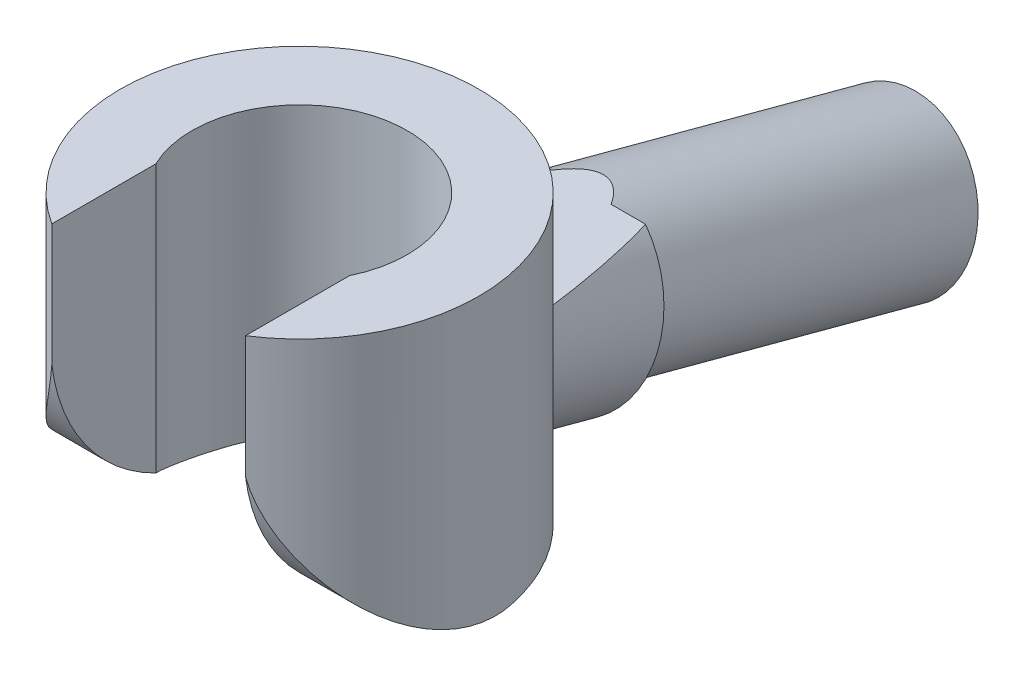
ISO-10303-21;
HEADER;
FILE_DESCRIPTION(('STEP AP214'),'2;1');
FILE_NAME('part.step','',(''),(''),'','','');
FILE_SCHEMA(('AUTOMOTIVE_DESIGN { 1 0 10303 214 1 1 1 1 }'));
ENDSEC;
DATA;
#1=APPLICATION_CONTEXT('core data for automotive mechanical design processes');
#2=APPLICATION_PROTOCOL_DEFINITION('international standard','automotive_design',2000,#1);
#3=PRODUCT_CONTEXT('',#1,'mechanical');
#4=PRODUCT('Part','Part','',(#3));
#5=PRODUCT_RELATED_PRODUCT_CATEGORY('part','',(#4));
#6=PRODUCT_DEFINITION_FORMATION('','',#4);
#7=PRODUCT_DEFINITION_CONTEXT('part definition',#1,'design');
#8=PRODUCT_DEFINITION('design','',#6,#7);
#9=PRODUCT_DEFINITION_SHAPE('','',#8);
#10=(LENGTH_UNIT() NAMED_UNIT(*) SI_UNIT(.MILLI.,.METRE.));
#11=(NAMED_UNIT(*) PLANE_ANGLE_UNIT() SI_UNIT($,.RADIAN.));
#12=(NAMED_UNIT(*) SI_UNIT($,.STERADIAN.) SOLID_ANGLE_UNIT());
#13=UNCERTAINTY_MEASURE_WITH_UNIT(LENGTH_MEASURE(1.E-05),#10,'distance_accuracy_value','');
#14=(GEOMETRIC_REPRESENTATION_CONTEXT(3) GLOBAL_UNCERTAINTY_ASSIGNED_CONTEXT((#13)) GLOBAL_UNIT_ASSIGNED_CONTEXT((#10,
#11,#12)) REPRESENTATION_CONTEXT('',''));
#15=CARTESIAN_POINT('',(0.,0.,0.));
#16=DIRECTION('',(0.,0.,1.));
#17=DIRECTION('',(1.,0.,0.));
#18=AXIS2_PLACEMENT_3D('',#15,#16,#17);
#19=CARTESIAN_POINT('',(0.,2.73055257875065,2.46568982603912));
#20=DIRECTION('',(0.,-0.258819045102525,-0.965925826289067));
#21=DIRECTION('',(0.,0.965925826289067,-0.258819045102525));
#22=AXIS2_PLACEMENT_3D('',#19,#20,#21);
#23=CYLINDRICAL_SURFACE('',#22,1.375);
#24=CARTESIAN_POINT('',(0.,1.08941714587697,-3.65911099154688));
#25=DIRECTION('',(0.,-0.258819045102525,-0.965925826289067));
#26=DIRECTION('',(0.,0.965925826289067,-0.258819045102525));
#27=AXIS2_PLACEMENT_3D('',#24,#25,#26);
#28=CIRCLE('',#27,1.375);
#29=CARTESIAN_POINT('',(0.892201129083852,2.1,-3.92989585119389));
#30=VERTEX_POINT('',#29);
#31=CARTESIAN_POINT('',(-0.892201129083852,2.1,-3.92989585119389));
#32=VERTEX_POINT('',#31);
#33=EDGE_CURVE('E154',#30,#32,#28,.T.);
#34=ORIENTED_EDGE('',*,*,#33,.F.);
#35=CARTESIAN_POINT('',(0.,2.1,0.112435565298172));
#36=DIRECTION('',(0.,1.,0.));
#37=DIRECTION('',(0.,0.,-1.));
#38=AXIS2_PLACEMENT_3D('',#35,#36,#37);
#39=ELLIPSE('',#38,5.31259204458979,1.375);
#40=CARTESIAN_POINT('',(1.24165045050928,2.1,-2.16986270504613));
#41=VERTEX_POINT('',#40);
#42=EDGE_CURVE('E138',#30,#41,#39,.F.);
#43=ORIENTED_EDGE('',*,*,#42,.T.);
#44=CARTESIAN_POINT('',(0.,2.82350474806387,-2.5));
#45=CARTESIAN_POINT('',(0.0756746206926173,2.82350481973341,-2.50000010305877));
#46=CARTESIAN_POINT('',(0.151348466781546,2.81794464872381,-2.49653681192855));
#47=CARTESIAN_POINT('',(0.300469222771982,2.79585754116698,-2.48300742184337));
#48=CARTESIAN_POINT('',(0.373915900409412,2.77932946489794,-2.47294063669243));
#49=CARTESIAN_POINT('',(0.516418098028429,2.73575134684504,-2.44715137212053));
#50=CARTESIAN_POINT('',(0.585480605710097,2.70871856411541,-2.43143817283314));
#51=CARTESIAN_POINT('',(0.717626682065278,2.64466303476343,-2.39576716763654));
#52=CARTESIAN_POINT('',(0.780708395119856,2.60763720128497,-2.37580805056634));
#53=CARTESIAN_POINT('',(0.901086748627024,2.52296993291815,-2.33286143686651));
#54=CARTESIAN_POINT('',(0.958166564467688,2.47505538269466,-2.30980369991073));
#55=CARTESIAN_POINT('',(1.06293822514273,2.36990313720084,-2.26350313879612));
#56=CARTESIAN_POINT('',(1.11062912830766,2.31266450781463,-2.24026029631495));
#57=CARTESIAN_POINT('',(1.19490798443668,2.19014375881825,-2.19646131225086));
#58=CARTESIAN_POINT('',(1.23156403467442,2.12491461966672,-2.1758891574924));
#59=CARTESIAN_POINT('',(1.29281867775416,1.9877231005591,-2.14006865928946));
#60=CARTESIAN_POINT('',(1.31743403935912,1.91577025194761,-2.12481292037677));
#61=CARTESIAN_POINT('',(1.35196875396347,1.77540392350226,-2.10298713986408));
#62=CARTESIAN_POINT('',(1.36316422192769,1.70741747844747,-2.095670752312));
#63=CARTESIAN_POINT('',(1.37545527447044,1.57016071933377,-2.08762498843449));
#64=CARTESIAN_POINT('',(1.37654861049603,1.50089012288367,-2.08689707858648));
#65=CARTESIAN_POINT('',(1.36942214648426,1.36516534456266,-2.09157692756388));
#66=CARTESIAN_POINT('',(1.36147772328356,1.29868858179155,-2.09680326965645));
#67=CARTESIAN_POINT('',(1.33757520770094,1.16780043102245,-2.11212928781745));
#68=CARTESIAN_POINT('',(1.32161438075243,1.10338975579292,-2.12223062680546));
#69=CARTESIAN_POINT('',(1.2791679773478,0.966985833322772,-2.14812597382072));
#70=CARTESIAN_POINT('',(1.25136645781807,0.895531923486745,-2.16459047646282));
#71=CARTESIAN_POINT('',(1.18674362860837,0.757616002295125,-2.20068376500393));
#72=CARTESIAN_POINT('',(1.14990992252638,0.691161017018117,-2.22031688696916));
#73=CARTESIAN_POINT('',(1.05916445052434,0.551013912644696,-2.26522461488661));
#74=CARTESIAN_POINT('',(1.00329491375036,0.478681330528588,-2.29082450757703));
#75=CARTESIAN_POINT('',(0.879492603879842,0.344827550156755,-2.34114172723943));
#76=CARTESIAN_POINT('',(0.811573876225654,0.283293928182841,-2.36586004198145));
#77=CARTESIAN_POINT('',(0.683206479212053,0.18815012776524,-2.40551568757814));
#78=CARTESIAN_POINT('',(0.625338666117882,0.151429857859372,-2.42133254007577));
#79=CARTESIAN_POINT('',(0.503874303996156,0.0872658339551569,-2.44948649690103));
#80=CARTESIAN_POINT('',(0.44028334169336,0.0598131550529236,-2.46182694717713));
#81=CARTESIAN_POINT('',(0.308063504573246,0.0157096646949467,-2.4818535818298));
#82=CARTESIAN_POINT('',(0.239395552336617,-0.000844918187461641,-2.48949826474742));
#83=CARTESIAN_POINT('',(0.0998110285036795,-0.0213367757863876,-2.4989823585276));
#84=CARTESIAN_POINT('',(0.0288963676595743,-0.0252844959717188,-2.50082657537144));
#85=CARTESIAN_POINT('',(-0.102748491236638,-0.0205709167046227,-2.49863664971227));
#86=CARTESIAN_POINT('',(-0.163557904460064,-0.0135440835903115,-2.49536443063183));
#87=CARTESIAN_POINT('',(-0.283003456159065,0.0096760962301037,-2.48465393798624));
#88=CARTESIAN_POINT('',(-0.34163935961826,0.0258704311334318,-2.47721521529993));
#89=CARTESIAN_POINT('',(-0.455701918169974,0.0665604500597686,-2.45880008644263));
#90=CARTESIAN_POINT('',(-0.511108649341796,0.0911023516525677,-2.44780400132952));
#91=CARTESIAN_POINT('',(-0.61753266617702,0.14729140231227,-2.42314752670379));
#92=CARTESIAN_POINT('',(-0.66854726392904,0.17894286014885,-2.40948552216394));
#93=CARTESIAN_POINT('',(-0.787425321158469,0.263714129024352,-2.3738871353891));
#94=CARTESIAN_POINT('',(-0.852665282212235,0.320115091501058,-2.35097667184598));
#95=CARTESIAN_POINT('',(-0.972585013733016,0.442852863124011,-2.3039627928177));
#96=CARTESIAN_POINT('',(-1.02724319459977,0.509209505196378,-2.27985706188609));
#97=CARTESIAN_POINT('',(-1.12629840209362,0.650905567293822,-2.23259891902422));
#98=CARTESIAN_POINT('',(-1.17054866646216,0.726353102402769,-2.20946353479141));
#99=CARTESIAN_POINT('',(-1.24716117896756,0.884046710061889,-2.16714235299558));
#100=CARTESIAN_POINT('',(-1.27953632613048,0.966285286309594,-2.14795227996602));
#101=CARTESIAN_POINT('',(-1.32685767340735,1.12204388884194,-2.1189827475853));
#102=CARTESIAN_POINT('',(-1.34379952310308,1.19476001058908,-2.10817239974021));
#103=CARTESIAN_POINT('',(-1.36736312572277,1.34250713030354,-2.09296995367779));
#104=CARTESIAN_POINT('',(-1.37399620091774,1.41753549616735,-2.08857081427194));
#105=CARTESIAN_POINT('',(-1.37579815356936,1.56844629871396,-2.08738789306386));
#106=CARTESIAN_POINT('',(-1.37087755029707,1.64433084175383,-2.09066355047372));
#107=CARTESIAN_POINT('',(-1.34869588547905,1.79351727418247,-2.10503905226756));
#108=CARTESIAN_POINT('',(-1.33143912004852,1.8668200533579,-2.1161361727785));
#109=CARTESIAN_POINT('',(-1.28769755080016,1.99954219122673,-2.14298791118527));
#110=CARTESIAN_POINT('',(-1.26258014986354,2.05956874755226,-2.15801751022668));
#111=CARTESIAN_POINT('',(-1.20369987647326,2.1742053935455,-2.19140346615113));
#112=CARTESIAN_POINT('',(-1.16993423053794,2.22881373779009,-2.2097608897105));
#113=CARTESIAN_POINT('',(-1.09282879509049,2.3341828657609,-2.24892804530785));
#114=CARTESIAN_POINT('',(-1.04911011587821,2.384637251991,-2.26981287658826));
#115=CARTESIAN_POINT('',(-0.95416866149967,2.47803288973589,-2.31133044591885));
#116=CARTESIAN_POINT('',(-0.902942911880863,2.52097114834234,-2.33196308051665));
#117=CARTESIAN_POINT('',(-0.788390350564423,2.60289454261766,-2.37329211518011));
#118=CARTESIAN_POINT('',(-0.724359567096987,2.64100836466509,-2.39377337204453));
#119=CARTESIAN_POINT('',(-0.590021914776225,2.7068766692259,-2.43037435788196));
#120=CARTESIAN_POINT('',(-0.51971505507127,2.73463116683933,-2.44649409321244));
#121=CARTESIAN_POINT('',(-0.37558472375676,2.77892663737088,-2.47269682255301));
#122=CARTESIAN_POINT('',(-0.301817629726865,2.79560629147746,-2.48285428267203));
#123=CARTESIAN_POINT('',(-0.152033088172532,2.81789405947923,-2.49650506643015));
#124=CARTESIAN_POINT('',(-0.0760161532806134,2.82350467607086,-2.49999989647611));
#125=CARTESIAN_POINT('',(0.,2.82350474806387,-2.5));
#126=B_SPLINE_CURVE_WITH_KNOTS('',3,(#44,#45,#46,#47,#48,#49,#50,#51,#52,#53,#54,#55,#56,#57,
#58,#59,#60,#61,#62,#63,#64,#65,#66,#67,#68,#69,#70,#71,#72,#73,#74,#75,#76,#77,#78,#79,#80,#81,
#82,#83,#84,#85,#86,#87,#88,#89,#90,#91,#92,#93,#94,#95,#96,#97,#98,#99,#100,#101,#102,#103,
#104,#105,#106,#107,#108,#109,#110,#111,#112,#113,#114,#115,#116,#117,#118,#119,#120,#121,#122,
#123,#124,#125),.UNSPECIFIED.,.T.,.F.,(4,2,2,2,2,2,2,2,2,2,2,2,2,2,2,2,2,2,2,2,2,2,2,2,2,2,2,2,
2,2,2,2,2,2,2,2,2,2,2,2,4),(0.,0.226745055751776,0.453513677239695,0.679911286365917,
0.906378909975966,1.13931803915239,1.37228051927934,1.60377441431508,1.83494498919001,
2.04173531040099,2.24857165831114,2.44927075661658,2.65003836421814,2.88446746190319,
3.11922012513576,3.40268327110739,3.68581813663379,3.89603589261602,4.10605062265587,
4.31789572851208,4.52956526361767,4.71258246081535,4.89561938983725,5.07968668791708,
5.26386584301999,5.53012762028791,5.79692704487656,6.06728902783554,6.33735646155111,
6.56281120355592,6.78801815003489,7.01497502174533,7.24185289334635,7.44130979437842,
7.64083074126372,7.84983838813175,8.05892907306925,8.28969644575822,8.52046348207278,
8.74828339300891,8.97605178822374),.UNSPECIFIED.);
#127=CARTESIAN_POINT('',(0.233011540176371,0.,-2.48911743839953));
#128=VERTEX_POINT('',#127);
#129=EDGE_CURVE('E147',#41,#128,#126,.T.);
#130=ORIENTED_EDGE('',*,*,#129,.T.);
#131=CARTESIAN_POINT('',(-0.23301154017637,0.,-2.48911743839953));
#132=VERTEX_POINT('',#131);
#133=EDGE_CURVE('E75',#128,#132,#126,.T.);
#134=ORIENTED_EDGE('',*,*,#133,.T.);
#135=CARTESIAN_POINT('',(-1.24165045050928,2.1,-2.16986270504613));
#136=VERTEX_POINT('',#135);
#137=EDGE_CURVE('E144',#132,#136,#126,.T.);
#138=ORIENTED_EDGE('',*,*,#137,.T.);
#139=EDGE_CURVE('E128',#136,#32,#39,.F.);
#140=ORIENTED_EDGE('',*,*,#139,.T.);
#141=EDGE_LOOP('',(#34,#43,#130,#134,#138,#140));
#142=FACE_BOUND('',#141,.T.);
#143=ADVANCED_FACE('F51',(#142),#23,.T.);
#144=CARTESIAN_POINT('',(0.,1.08941714587697,-3.65911099154688));
#145=DIRECTION('',(0.,-0.258819045102525,-0.965925826289067));
#146=DIRECTION('',(0.,0.965925826289067,-0.258819045102525));
#147=AXIS2_PLACEMENT_3D('',#144,#145,#146);
#148=PLANE('',#147);
#149=ORIENTED_EDGE('',*,*,#33,.T.);
#150=DIRECTION('',(1.,0.,0.));
#151=VECTOR('',#150,1.);
#152=CARTESIAN_POINT('',(0.,2.1,-3.92989585119389));
#153=LINE('',#152,#151);
#154=CARTESIAN_POINT('',(-0.413549095922722,2.1,-3.92989585119389));
#155=VERTEX_POINT('',#154);
#156=EDGE_CURVE('E134',#32,#155,#153,.T.);
#157=ORIENTED_EDGE('',*,*,#156,.T.);
#158=CARTESIAN_POINT('',(0.,1.08941714587697,-3.65911099154688));
#159=DIRECTION('',(0.,-0.258819045102525,-0.965925826289067));
#160=DIRECTION('',(0.,0.965925826289067,-0.258819045102525));
#161=AXIS2_PLACEMENT_3D('',#158,#159,#160);
#162=CIRCLE('',#161,1.125);
#163=CARTESIAN_POINT('',(0.413549095922722,2.1,-3.92989585119389));
#164=VERTEX_POINT('',#163);
#165=EDGE_CURVE('E61',#155,#164,#162,.F.);
#166=ORIENTED_EDGE('',*,*,#165,.T.);
#167=EDGE_CURVE('E68',#164,#30,#153,.T.);
#168=ORIENTED_EDGE('',*,*,#167,.T.);
#169=EDGE_LOOP('',(#149,#157,#166,#168));
#170=FACE_BOUND('',#169,.T.);
#171=ADVANCED_FACE('F180',(#170),#148,.T.);
#172=CARTESIAN_POINT('',(0.,2.72572524848298,2.44767398421526));
#173=DIRECTION('',(0.,-0.258819045102525,-0.965925826289067));
#174=DIRECTION('',(0.,0.965925826289067,-0.258819045102525));
#175=AXIS2_PLACEMENT_3D('',#172,#173,#174);
#176=CYLINDRICAL_SURFACE('',#175,1.125);
#177=CARTESIAN_POINT('',(0.,-0.152914270615149,-8.2955549577344));
#178=DIRECTION('',(0.,-0.258819045102525,-0.965925826289067));
#179=DIRECTION('',(0.,0.965925826289067,-0.258819045102525));
#180=AXIS2_PLACEMENT_3D('',#177,#178,#179);
#181=CIRCLE('',#180,1.125);
#182=CARTESIAN_POINT('',(0.,0.933752283960052,-8.58672638347474));
#183=VERTEX_POINT('',#182);
#184=EDGE_CURVE('E369',#183,#183,#181,.T.);
#185=ORIENTED_EDGE('',*,*,#184,.F.);
#186=EDGE_LOOP('',(#185));
#187=FACE_BOUND('',#186,.T.);
#188=ORIENTED_EDGE('',*,*,#165,.F.);
#189=CARTESIAN_POINT('',(0.,2.1,0.112435565298172));
#190=DIRECTION('',(0.,1.,0.));
#191=DIRECTION('',(0.,0.,-1.));
#192=AXIS2_PLACEMENT_3D('',#189,#190,#191);
#193=ELLIPSE('',#192,4.34666621830074,1.125);
#194=EDGE_CURVE('E13',#155,#164,#193,.F.);
#195=ORIENTED_EDGE('',*,*,#194,.T.);
#196=EDGE_LOOP('',(#188,#195));
#197=FACE_BOUND('',#196,.T.);
#198=ADVANCED_FACE('F176',(#187,#197),#176,.T.);
#199=CARTESIAN_POINT('',(0.,4.,0.));
#200=DIRECTION('',(0.,1.,0.));
#201=DIRECTION('',(0.,0.,1.));
#202=AXIS2_PLACEMENT_3D('',#199,#200,#201);
#203=PLANE('',#202);
#204=DIRECTION('',(0.,0.,1.));
#205=VECTOR('',#204,1.);
#206=CARTESIAN_POINT('',(-1.35,4.,3.15418491724055));
#207=LINE('',#206,#205);
#208=CARTESIAN_POINT('',(-1.35,4.,0.653834841531102));
#209=VERTEX_POINT('',#208);
#210=CARTESIAN_POINT('',(-1.35,4.,2.10416254125008));
#211=VERTEX_POINT('',#210);
#212=EDGE_CURVE('E388',#209,#211,#207,.T.);
#213=ORIENTED_EDGE('',*,*,#212,.F.);
#214=CARTESIAN_POINT('',(0.,4.,0.));
#215=DIRECTION('',(0.,1.,0.));
#216=DIRECTION('',(0.,0.,1.));
#217=AXIS2_PLACEMENT_3D('',#214,#215,#216);
#218=CIRCLE('',#217,1.5);
#219=CARTESIAN_POINT('',(1.35,4.,0.6538348415311));
#220=VERTEX_POINT('',#219);
#221=EDGE_CURVE('E402',#220,#209,#218,.T.);
#222=ORIENTED_EDGE('',*,*,#221,.F.);
#223=DIRECTION('',(0.,0.,-1.));
#224=VECTOR('',#223,1.);
#225=CARTESIAN_POINT('',(1.35,4.,0.));
#226=LINE('',#225,#224);
#227=CARTESIAN_POINT('',(1.35,4.,2.10416254125008));
#228=VERTEX_POINT('',#227);
#229=EDGE_CURVE('E340',#228,#220,#226,.T.);
#230=ORIENTED_EDGE('',*,*,#229,.F.);
#231=CARTESIAN_POINT('',(0.,4.,0.));
#232=DIRECTION('',(0.,1.,0.));
#233=DIRECTION('',(0.,0.,1.));
#234=AXIS2_PLACEMENT_3D('',#231,#232,#233);
#235=CIRCLE('',#234,2.5);
#236=EDGE_CURVE('E346',#228,#211,#235,.T.);
#237=ORIENTED_EDGE('',*,*,#236,.T.);
#238=EDGE_LOOP('',(#213,#222,#230,#237));
#239=FACE_BOUND('',#238,.T.);
#240=ADVANCED_FACE('F179',(#239),#203,.T.);
#241=CARTESIAN_POINT('',(0.,0.,0.));
#242=DIRECTION('',(0.,1.,0.));
#243=DIRECTION('',(0.,0.,1.));
#244=AXIS2_PLACEMENT_3D('',#241,#242,#243);
#245=PLANE('',#244);
#246=CARTESIAN_POINT('',(0.,0.,0.));
#247=DIRECTION('',(0.,1.,0.));
#248=DIRECTION('',(0.,0.,1.));
#249=AXIS2_PLACEMENT_3D('',#246,#247,#248);
#250=CIRCLE('',#249,2.5);
#251=CARTESIAN_POINT('',(2.44948974278318,0.,-0.5));
#252=VERTEX_POINT('',#251);
#253=EDGE_CURVE('E352',#252,#128,#250,.T.);
#254=ORIENTED_EDGE('',*,*,#253,.F.);
#255=DIRECTION('',(1.,0.,0.));
#256=VECTOR('',#255,1.);
#257=CARTESIAN_POINT('',(-2.5,0.,-0.5));
#258=LINE('',#257,#256);
#259=CARTESIAN_POINT('',(1.4142135623731,0.,-0.5));
#260=VERTEX_POINT('',#259);
#261=EDGE_CURVE('E372',#260,#252,#258,.T.);
#262=ORIENTED_EDGE('',*,*,#261,.F.);
#263=CARTESIAN_POINT('',(0.,0.,0.));
#264=DIRECTION('',(0.,1.,0.));
#265=DIRECTION('',(0.,0.,1.));
#266=AXIS2_PLACEMENT_3D('',#263,#264,#265);
#267=CIRCLE('',#266,1.5);
#268=CARTESIAN_POINT('',(-1.4142135623731,0.,-0.5));
#269=VERTEX_POINT('',#268);
#270=EDGE_CURVE('E398',#260,#269,#267,.T.);
#271=ORIENTED_EDGE('',*,*,#270,.T.);
#272=CARTESIAN_POINT('',(-2.44948974278318,0.,-0.5));
#273=VERTEX_POINT('',#272);
#274=EDGE_CURVE('E375',#273,#269,#258,.T.);
#275=ORIENTED_EDGE('',*,*,#274,.F.);
#276=EDGE_CURVE('E405',#132,#273,#250,.T.);
#277=ORIENTED_EDGE('',*,*,#276,.F.);
#278=CARTESIAN_POINT('',(0.,0.,0.));
#279=DIRECTION('',(0.,1.,0.));
#280=DIRECTION('',(0.,0.,1.));
#281=AXIS2_PLACEMENT_3D('',#278,#279,#280);
#282=CIRCLE('',#281,2.5);
#283=EDGE_CURVE('E162',#132,#128,#282,.F.);
#284=ORIENTED_EDGE('',*,*,#283,.T.);
#285=EDGE_LOOP('',(#254,#262,#271,#275,#277,#284));
#286=FACE_BOUND('',#285,.T.);
#287=ADVANCED_FACE('F230',(#286),#245,.F.);
#288=CARTESIAN_POINT('',(0.,4.,0.));
#289=DIRECTION('',(0.,-1.,0.));
#290=DIRECTION('',(0.,0.,-1.));
#291=AXIS2_PLACEMENT_3D('',#288,#289,#290);
#292=CYLINDRICAL_SURFACE('',#291,2.5);
#293=DIRECTION('',(0.,-1.,0.));
#294=VECTOR('',#293,1.);
#295=CARTESIAN_POINT('',(-1.35,4.,2.10416254125008));
#296=LINE('',#295,#294);
#297=CARTESIAN_POINT('',(-1.35,2.3,2.10416254125008));
#298=VERTEX_POINT('',#297);
#299=EDGE_CURVE('E395',#298,#211,#296,.F.);
#300=ORIENTED_EDGE('',*,*,#299,.T.);
#301=ORIENTED_EDGE('',*,*,#236,.F.);
#302=DIRECTION('',(0.,-1.,0.));
#303=VECTOR('',#302,1.);
#304=CARTESIAN_POINT('',(1.35,4.,2.10416254125008));
#305=LINE('',#304,#303);
#306=CARTESIAN_POINT('',(1.35,2.3,2.10416254125008));
#307=VERTEX_POINT('',#306);
#308=EDGE_CURVE('E392',#228,#307,#305,.T.);
#309=ORIENTED_EDGE('',*,*,#308,.T.);
#310=CARTESIAN_POINT('',(1.35,2.3,2.10416254125008));
#311=CARTESIAN_POINT('',(1.36351517193992,2.23038087333844,2.09549047514903));
#312=CARTESIAN_POINT('',(1.38091321280894,2.16205714878144,2.0841517596051));
#313=CARTESIAN_POINT('',(1.42154094714728,2.02847055895948,2.05665139196168));
#314=CARTESIAN_POINT('',(1.44474532500651,1.96319582930358,2.04051062053209));
#315=CARTESIAN_POINT('',(1.49507030762803,1.83590336040458,2.0039280390569));
#316=CARTESIAN_POINT('',(1.52217030098942,1.77387068641268,1.98350862187017));
#317=CARTESIAN_POINT('',(1.57900985866205,1.65247301925095,1.93856756619751));
#318=CARTESIAN_POINT('',(1.60875289949933,1.59311169909167,1.91404048606603));
#319=CARTESIAN_POINT('',(1.67850902947904,1.46031402648567,1.85345744661983));
#320=CARTESIAN_POINT('',(1.7190206503008,1.38772493084354,1.81611262083681));
#321=CARTESIAN_POINT('',(1.80076748103185,1.24667889391936,1.7350972453077));
#322=CARTESIAN_POINT('',(1.84200262271298,1.1782215656852,1.69142728923498));
#323=CARTESIAN_POINT('',(1.96493734768176,0.978606213693664,1.55064796955403));
#324=CARTESIAN_POINT('',(2.04574746312107,0.853414621066346,1.44386508775217));
#325=CARTESIAN_POINT('',(2.17625604363792,0.651399105226241,1.23492774735109));
#326=CARTESIAN_POINT('',(2.22864347954362,0.570366414153451,1.13848608966499));
#327=CARTESIAN_POINT('',(2.32271203983696,0.421191120436153,0.931577509880182));
#328=CARTESIAN_POINT('',(2.36442096881449,0.353015166182571,0.821148154330056));
#329=CARTESIAN_POINT('',(2.42678036055965,0.243331863034661,0.608839513243117));
#330=CARTESIAN_POINT('',(2.44987427801288,0.199231581227174,0.509021496327746));
#331=CARTESIAN_POINT('',(2.48378642408959,0.123395394578649,0.302761855224059));
#332=CARTESIAN_POINT('',(2.49461892111016,0.0916451465338719,0.196328082207745));
#333=CARTESIAN_POINT('',(2.50015358805605,0.0556468159376632,0.0398593903577073));
#334=CARTESIAN_POINT('',(2.50046361005327,0.0459003852551461,-0.00880894379472793));
#335=CARTESIAN_POINT('',(2.49820510086762,0.0291871888138619,-0.106564880691923));
#336=CARTESIAN_POINT('',(2.49563679697656,0.0222202036304546,-0.155652450027333));
#337=CARTESIAN_POINT('',(2.48754309497462,0.0110718598248004,-0.254125787871645));
#338=CARTESIAN_POINT('',(2.48200423535001,0.00690337821722598,-0.303511893898604));
#339=CARTESIAN_POINT('',(2.46796617473349,0.00136294538310998,-0.402032537699327));
#340=CARTESIAN_POINT('',(2.45946622061083,-8.2937782742311E-06,-0.45116700824249));
#341=CARTESIAN_POINT('',(2.44948974278318,0.,-0.5));
#342=B_SPLINE_CURVE_WITH_KNOTS('',3,(#310,#311,#312,#313,#314,#315,#316,#317,#318,#319,#320,
#321,#322,#323,#324,#325,#326,#327,#328,#329,#330,#331,#332,#333,#334,#335,#336,#337,#338,#339,
#340,#341),.UNSPECIFIED.,.F.,.F.,(4,2,2,2,2,2,2,2,2,2,2,2,2,2,2,4),(0.,0.21388345861973,
0.426850157356095,0.638728926151715,0.850890635397252,1.12391365881172,1.3969110730166,
1.94367564672557,2.35157065835715,2.75839254050403,3.09169557464955,3.42461034994189,
3.57338663818592,3.72215117889017,3.87159563601557,4.02107813093012),.UNSPECIFIED.);
#343=EDGE_CURVE('E215',#307,#252,#342,.T.);
#344=ORIENTED_EDGE('',*,*,#343,.T.);
#345=ORIENTED_EDGE('',*,*,#253,.T.);
#346=ORIENTED_EDGE('',*,*,#129,.F.);
#347=CARTESIAN_POINT('',(0.,2.1,0.));
#348=DIRECTION('',(0.,1.,0.));
#349=DIRECTION('',(0.,0.,1.));
#350=AXIS2_PLACEMENT_3D('',#347,#348,#349);
#351=CIRCLE('',#350,2.5);
#352=EDGE_CURVE('E131',#136,#41,#351,.F.);
#353=ORIENTED_EDGE('',*,*,#352,.F.);
#354=ORIENTED_EDGE('',*,*,#137,.F.);
#355=ORIENTED_EDGE('',*,*,#276,.T.);
#356=CARTESIAN_POINT('',(-2.44948974278318,0.,-0.5));
#357=CARTESIAN_POINT('',(-2.46043782423083,-1.22960023710364E-05,-0.446426952332522));
#358=CARTESIAN_POINT('',(-2.46960447026707,0.00164025307823841,-0.39249021938658));
#359=CARTESIAN_POINT('',(-2.48437182629474,0.00831758881083121,-0.284354565669709));
#360=CARTESIAN_POINT('',(-2.48997359741295,0.0133413710601557,-0.230155727762011));
#361=CARTESIAN_POINT('',(-2.49759057772106,0.0267612330084932,-0.122269699552724));
#362=CARTESIAN_POINT('',(-2.49962817163385,0.0351358563903735,-0.0685814375944163));
#363=CARTESIAN_POINT('',(-2.50027938514236,0.0552011617026611,0.0381770969913491));
#364=CARTESIAN_POINT('',(-2.49889298114054,0.0668918664863675,0.0912473653571819));
#365=CARTESIAN_POINT('',(-2.48979976556173,0.106789172049219,0.248852177360237));
#366=CARTESIAN_POINT('',(-2.47716986967941,0.139841959774321,0.351948314177035));
#367=CARTESIAN_POINT('',(-2.44052777781505,0.217481665588309,0.551517212278167));
#368=CARTESIAN_POINT('',(-2.41650276032852,0.262081550445002,0.647982372219373));
#369=CARTESIAN_POINT('',(-2.35060879419707,0.376063515918866,0.860488375430432));
#370=CARTESIAN_POINT('',(-2.30554723309455,0.448865279724963,0.973701151540438));
#371=CARTESIAN_POINT('',(-2.20445441955575,0.608021996260256,1.18497562153919));
#372=CARTESIAN_POINT('',(-2.14838931150038,0.69441861060799,1.28298883986982));
#373=CARTESIAN_POINT('',(-2.05122492939242,0.84507957845647,1.43081832843496));
#374=CARTESIAN_POINT('',(-2.01200913793902,0.906106428108687,1.48527845345911));
#375=CARTESIAN_POINT('',(-1.9320699834494,1.0323474006754,1.58786975107115));
#376=CARTESIAN_POINT('',(-1.89134678494387,1.09756106717395,1.63600161178217));
#377=CARTESIAN_POINT('',(-1.80974670127137,1.23179327068719,1.72582929496856));
#378=CARTESIAN_POINT('',(-1.76887073442344,1.3007988675339,1.76754536030468));
#379=CARTESIAN_POINT('',(-1.68824199701682,1.44287714149765,1.84470761714713));
#380=CARTESIAN_POINT('',(-1.64848918222079,1.51594965809418,1.88015405588396));
#381=CARTESIAN_POINT('',(-1.58267176897159,1.64536631295981,1.93557541304816));
#382=CARTESIAN_POINT('',(-1.55588638392226,1.70067880502947,1.9571057555279));
#383=CARTESIAN_POINT('',(-1.50481813669568,1.81360054534255,1.99663776907348));
#384=CARTESIAN_POINT('',(-1.48053233154361,1.87120697922695,2.01464361290913));
#385=CARTESIAN_POINT('',(-1.43544923218275,1.98921303848159,2.0470126446107));
#386=CARTESIAN_POINT('',(-1.41467261911497,2.04962671771248,2.06135447657868));
#387=CARTESIAN_POINT('',(-1.37815168225906,2.17299579035615,2.08594976149757));
#388=CARTESIAN_POINT('',(-1.36242648035574,2.23595984897034,2.09618771480464));
#389=CARTESIAN_POINT('',(-1.35000000000006,2.30000000000002,2.1041625412501));
#390=B_SPLINE_CURVE_WITH_KNOTS('',3,(#356,#357,#358,#359,#360,#361,#362,#363,#364,#365,#366,
#367,#368,#369,#370,#371,#372,#373,#374,#375,#376,#377,#378,#379,#380,#381,#382,#383,#384,#385,
#386,#387,#388,#389),.UNSPECIFIED.,.F.,.F.,(4,2,2,2,2,2,2,2,2,2,2,2,2,2,2,2,4),(0.,
0.163984580706249,0.327920326621867,0.490822731017619,0.65372625810831,0.979032508084697,
1.30470565595084,1.72824131127714,2.15310112530948,2.42492539179971,2.69672007615975,
2.967638788869,3.23854681604415,3.43374970229534,3.62872006471698,3.82480215083707,
4.0216179811305),.UNSPECIFIED.);
#391=EDGE_CURVE('E202',#273,#298,#390,.T.);
#392=ORIENTED_EDGE('',*,*,#391,.T.);
#393=EDGE_LOOP('',(#300,#301,#309,#344,#345,#346,#353,#354,#355,#392));
#394=FACE_BOUND('',#393,.T.);
#395=ADVANCED_FACE('F53',(#394),#292,.T.);
#396=CARTESIAN_POINT('',(0.,4.,0.));
#397=DIRECTION('',(0.,-1.,0.));
#398=DIRECTION('',(0.,0.,-1.));
#399=AXIS2_PLACEMENT_3D('',#396,#397,#398);
#400=CYLINDRICAL_SURFACE('',#399,1.5);
#401=CARTESIAN_POINT('',(1.35,0.267267543843128,0.653834841531102));
#402=CARTESIAN_POINT('',(1.36633063818247,0.25075720524737,0.620109241700244));
#403=CARTESIAN_POINT('',(1.38149466230228,0.234754125827008,0.585582211188813));
#404=CARTESIAN_POINT('',(1.40933404813439,0.203926628551633,0.514997234861595));
#405=CARTESIAN_POINT('',(1.42200747079128,0.189103134362418,0.478938122598445));
#406=CARTESIAN_POINT('',(1.45609450406794,0.146596706883479,0.368418851244988));
#407=CARTESIAN_POINT('',(1.47346938973809,0.120984548426078,0.291831351532618));
#408=CARTESIAN_POINT('',(1.49607766555339,0.0765508503164539,0.134537602576767));
#409=CARTESIAN_POINT('',(1.50124875907223,0.0577645649591205,0.0538123605953848));
#410=CARTESIAN_POINT('',(1.4982504526512,0.0280436265144617,-0.108627623623909));
#411=CARTESIAN_POINT('',(1.4901284496456,0.0170812769280051,-0.190337823651603));
#412=CARTESIAN_POINT('',(1.46818312898731,0.0066053718119944,-0.309847138386396));
#413=CARTESIAN_POINT('',(1.45951123997034,0.00410269961131612,-0.348412967967329));
#414=CARTESIAN_POINT('',(1.43912788632961,0.000798341478153169,-0.424821288282386));
#415=CARTESIAN_POINT('',(1.42741543235405,-2.79001939336072E-06,-0.462663539264412));
#416=CARTESIAN_POINT('',(1.41421356237334,-1.12953978262727E-13,-0.500000000000036));
#417=B_SPLINE_CURVE_WITH_KNOTS('',3,(#401,#402,#403,#404,#405,#406,#407,#408,#409,#410,#411,
#412,#413,#414,#415,#416),.UNSPECIFIED.,.F.,.F.,(4,2,2,2,2,2,2,4),(0.,0.12278914141707,
0.245673504741852,0.492219080248995,0.740020498675876,0.986940297001302,1.10562669409591,
1.2243517583797),.UNSPECIFIED.);
#418=CARTESIAN_POINT('',(1.35,0.267267543843127,0.6538348415311));
#419=VERTEX_POINT('',#418);
#420=EDGE_CURVE('E209',#419,#260,#417,.T.);
#421=ORIENTED_EDGE('',*,*,#420,.F.);
#422=DIRECTION('',(0.,-1.,0.));
#423=VECTOR('',#422,1.);
#424=CARTESIAN_POINT('',(1.35,4.,0.6538348415311));
#425=LINE('',#424,#423);
#426=EDGE_CURVE('E337',#220,#419,#425,.T.);
#427=ORIENTED_EDGE('',*,*,#426,.F.);
#428=ORIENTED_EDGE('',*,*,#221,.T.);
#429=DIRECTION('',(0.,-1.,0.));
#430=VECTOR('',#429,1.);
#431=CARTESIAN_POINT('',(-1.35,4.,0.653834841531102));
#432=LINE('',#431,#430);
#433=CARTESIAN_POINT('',(-1.35,0.267267543843128,0.653834841531102));
#434=VERTEX_POINT('',#433);
#435=EDGE_CURVE('E345',#434,#209,#432,.F.);
#436=ORIENTED_EDGE('',*,*,#435,.F.);
#437=CARTESIAN_POINT('',(-1.4142135623731,0.,-0.5));
#438=CARTESIAN_POINT('',(-1.42681644830846,-2.81605277952208E-06,-0.464358866911676));
#439=CARTESIAN_POINT('',(-1.43806226018128,0.000727147987933746,-0.428254511041751));
#440=CARTESIAN_POINT('',(-1.45778686385782,0.00373512279118509,-0.355363923365228));
#441=CARTESIAN_POINT('',(-1.46626583386106,0.00601303382846329,-0.318577735633604));
#442=CARTESIAN_POINT('',(-1.48738718228693,0.015253954549242,-0.208017807046626));
#443=CARTESIAN_POINT('',(-1.49587226112636,0.0246221850623208,-0.133592115718953));
#444=CARTESIAN_POINT('',(-1.50176594132719,0.0498436224482136,0.0145743687023676));
#445=CARTESIAN_POINT('',(-1.49916819414523,0.0657005415151696,0.0883147449871424));
#446=CARTESIAN_POINT('',(-1.48355184256055,0.103397060669182,0.233214704131816));
#447=CARTESIAN_POINT('',(-1.4705183403082,0.125245184325978,0.304370445307277));
#448=CARTESIAN_POINT('',(-1.44013942945274,0.166966334837842,0.422597583516235));
#449=CARTESIAN_POINT('',(-1.42510096127744,0.185610308187972,0.470726027291906));
#450=CARTESIAN_POINT('',(-1.39069373302047,0.224974916339269,0.564310339633537));
#451=CARTESIAN_POINT('',(-1.37134015760996,0.245688131836643,0.609774890649423));
#452=CARTESIAN_POINT('',(-1.35000000000052,0.267267543843135,0.653834841531232));
#453=B_SPLINE_CURVE_WITH_KNOTS('',3,(#437,#438,#439,#440,#441,#442,#443,#444,#445,#446,#447,
#448,#449,#450,#451,#452),.UNSPECIFIED.,.F.,.F.,(4,2,2,2,2,2,2,4),(0.,0.113344301097838,
0.226681300770992,0.451941693385612,0.677331138582873,0.903042919601758,1.06405455727978,
1.2245083021788),.UNSPECIFIED.);
#454=EDGE_CURVE('E192',#269,#434,#453,.T.);
#455=ORIENTED_EDGE('',*,*,#454,.F.);
#456=ORIENTED_EDGE('',*,*,#270,.F.);
#457=EDGE_LOOP('',(#421,#427,#428,#436,#455,#456));
#458=FACE_BOUND('',#457,.T.);
#459=ADVANCED_FACE('F222',(#458),#400,.F.);
#460=CARTESIAN_POINT('',(1.35,0.,0.));
#461=DIRECTION('',(1.,0.,0.));
#462=DIRECTION('',(0.,0.,-1.));
#463=AXIS2_PLACEMENT_3D('',#460,#461,#462);
#464=PLANE('',#463);
#465=ORIENTED_EDGE('',*,*,#426,.T.);
#466=CARTESIAN_POINT('',(1.35,2.62427446548915,-0.5));
#467=DIRECTION('',(1.,0.,0.));
#468=DIRECTION('',(0.,0.,-1.));
#469=AXIS2_PLACEMENT_3D('',#466,#467,#468);
#470=CIRCLE('',#469,2.62427446548915);
#471=EDGE_CURVE('E216',#419,#307,#470,.F.);
#472=ORIENTED_EDGE('',*,*,#471,.T.);
#473=ORIENTED_EDGE('',*,*,#308,.F.);
#474=ORIENTED_EDGE('',*,*,#229,.T.);
#475=EDGE_LOOP('',(#465,#472,#473,#474));
#476=FACE_BOUND('',#475,.T.);
#477=ADVANCED_FACE('F187',(#476),#464,.F.);
#478=CARTESIAN_POINT('',(-1.35,0.,3.15418491724055));
#479=DIRECTION('',(-1.,0.,0.));
#480=DIRECTION('',(0.,0.,1.));
#481=AXIS2_PLACEMENT_3D('',#478,#479,#480);
#482=PLANE('',#481);
#483=ORIENTED_EDGE('',*,*,#299,.F.);
#484=CARTESIAN_POINT('',(-1.35,2.62427446548915,-0.5));
#485=DIRECTION('',(-1.,0.,0.));
#486=DIRECTION('',(0.,0.,1.));
#487=AXIS2_PLACEMENT_3D('',#484,#485,#486);
#488=CIRCLE('',#487,2.62427446548915);
#489=EDGE_CURVE('E350',#298,#434,#488,.F.);
#490=ORIENTED_EDGE('',*,*,#489,.T.);
#491=ORIENTED_EDGE('',*,*,#435,.T.);
#492=ORIENTED_EDGE('',*,*,#212,.T.);
#493=EDGE_LOOP('',(#483,#490,#491,#492));
#494=FACE_BOUND('',#493,.T.);
#495=ADVANCED_FACE('F227',(#494),#482,.F.);
#496=CARTESIAN_POINT('',(-2.5,2.62427446548915,-0.5));
#497=DIRECTION('',(1.,0.,0.));
#498=DIRECTION('',(0.,0.,-1.));
#499=AXIS2_PLACEMENT_3D('',#496,#497,#498);
#500=CYLINDRICAL_SURFACE('',#499,2.62427446548915);
#501=ORIENTED_EDGE('',*,*,#274,.T.);
#502=ORIENTED_EDGE('',*,*,#454,.T.);
#503=ORIENTED_EDGE('',*,*,#489,.F.);
#504=ORIENTED_EDGE('',*,*,#391,.F.);
#505=EDGE_LOOP('',(#501,#502,#503,#504));
#506=FACE_BOUND('',#505,.T.);
#507=ADVANCED_FACE('F185',(#506),#500,.T.);
#508=ORIENTED_EDGE('',*,*,#471,.F.);
#509=ORIENTED_EDGE('',*,*,#420,.T.);
#510=ORIENTED_EDGE('',*,*,#261,.T.);
#511=ORIENTED_EDGE('',*,*,#343,.F.);
#512=EDGE_LOOP('',(#508,#509,#510,#511));
#513=FACE_BOUND('',#512,.T.);
#514=ADVANCED_FACE('F171',(#513),#500,.T.);
#515=CARTESIAN_POINT('',(0.,4.,0.));
#516=DIRECTION('',(0.,-1.,0.));
#517=DIRECTION('',(0.,0.,-1.));
#518=AXIS2_PLACEMENT_3D('',#515,#516,#517);
#519=CYLINDRICAL_SURFACE('',#518,2.5);
#520=ORIENTED_EDGE('',*,*,#283,.F.);
#521=ORIENTED_EDGE('',*,*,#133,.F.);
#522=EDGE_LOOP('',(#520,#521));
#523=FACE_BOUND('',#522,.T.);
#524=ADVANCED_FACE('F166',(#523),#519,.F.);
#525=CARTESIAN_POINT('',(0.,-0.152914270615149,-8.2955549577344));
#526=DIRECTION('',(0.,-0.258819045102525,-0.965925826289067));
#527=DIRECTION('',(0.,0.965925826289067,-0.258819045102525));
#528=AXIS2_PLACEMENT_3D('',#525,#526,#527);
#529=PLANE('',#528);
#530=ORIENTED_EDGE('',*,*,#184,.T.);
#531=EDGE_LOOP('',(#530));
#532=FACE_BOUND('',#531,.T.);
#533=ADVANCED_FACE('F170',(#532),#529,.T.);
#534=CARTESIAN_POINT('',(-2.13014509003555,2.1,2.12527446548915));
#535=DIRECTION('',(0.,1.,0.));
#536=DIRECTION('',(0.,0.,1.));
#537=AXIS2_PLACEMENT_3D('',#534,#535,#536);
#538=PLANE('',#537);
#539=ORIENTED_EDGE('',*,*,#167,.F.);
#540=ORIENTED_EDGE('',*,*,#194,.F.);
#541=ORIENTED_EDGE('',*,*,#156,.F.);
#542=ORIENTED_EDGE('',*,*,#139,.F.);
#543=ORIENTED_EDGE('',*,*,#352,.T.);
#544=ORIENTED_EDGE('',*,*,#42,.F.);
#545=EDGE_LOOP('',(#539,#540,#541,#542,#543,#544));
#546=FACE_BOUND('',#545,.T.);
#547=ADVANCED_FACE('F130',(#546),#538,.T.);
#548=CLOSED_SHELL('',(#143,#171,#198,#240,#287,#395,#459,#477,#495,#507,#514,#524,#533,#547));
#549=MANIFOLD_SOLID_BREP('B2',#548);
#550=ADVANCED_BREP_SHAPE_REPRESENTATION('',(#18,#549),#14);
#551=SHAPE_DEFINITION_REPRESENTATION(#9,#550);
ENDSEC;
END-ISO-10303-21;
